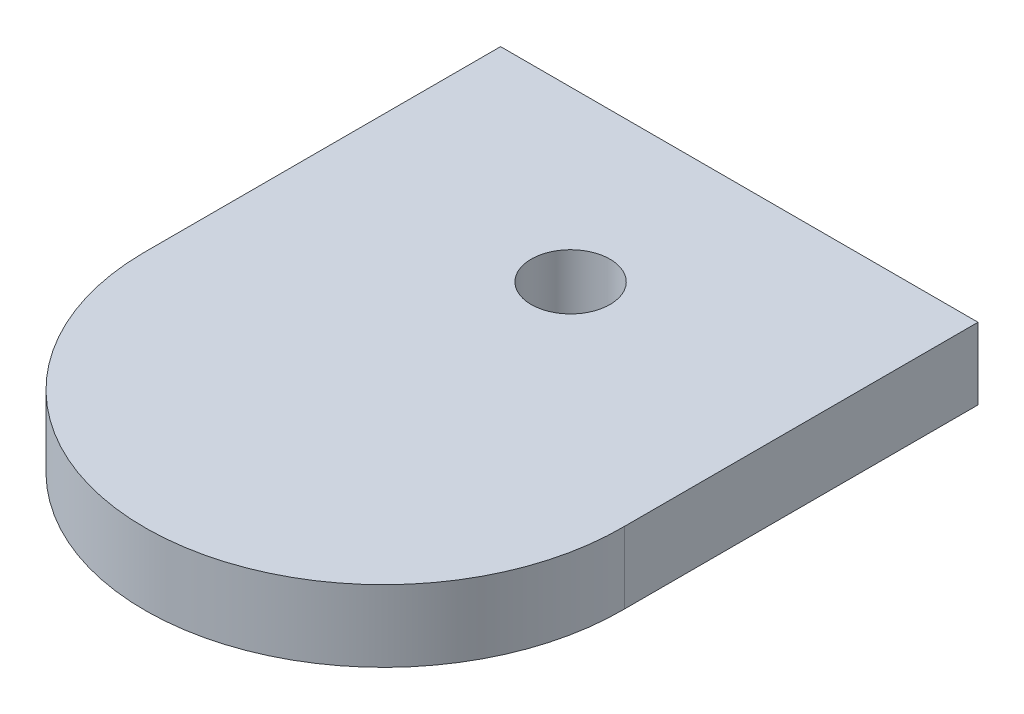
ISO-10303-21;
HEADER;
FILE_DESCRIPTION(('STEP AP214'),'2;1');
FILE_NAME('part.step','',(''),(''),'','','');
FILE_SCHEMA(('AUTOMOTIVE_DESIGN { 1 0 10303 214 1 1 1 1 }'));
ENDSEC;
DATA;
#1=APPLICATION_CONTEXT('core data for automotive mechanical design processes');
#2=APPLICATION_PROTOCOL_DEFINITION('international standard','automotive_design',2000,#1);
#3=PRODUCT_CONTEXT('',#1,'mechanical');
#4=PRODUCT('Part','Part','',(#3));
#5=PRODUCT_RELATED_PRODUCT_CATEGORY('part','',(#4));
#6=PRODUCT_DEFINITION_FORMATION('','',#4);
#7=PRODUCT_DEFINITION_CONTEXT('part definition',#1,'design');
#8=PRODUCT_DEFINITION('design','',#6,#7);
#9=PRODUCT_DEFINITION_SHAPE('','',#8);
#10=(LENGTH_UNIT() NAMED_UNIT(*) SI_UNIT(.MILLI.,.METRE.));
#11=(NAMED_UNIT(*) PLANE_ANGLE_UNIT() SI_UNIT($,.RADIAN.));
#12=(NAMED_UNIT(*) SI_UNIT($,.STERADIAN.) SOLID_ANGLE_UNIT());
#13=UNCERTAINTY_MEASURE_WITH_UNIT(LENGTH_MEASURE(1.E-05),#10,'distance_accuracy_value','');
#14=(GEOMETRIC_REPRESENTATION_CONTEXT(3) GLOBAL_UNCERTAINTY_ASSIGNED_CONTEXT((#13)) GLOBAL_UNIT_ASSIGNED_CONTEXT((#10,
#11,#12)) REPRESENTATION_CONTEXT('',''));
#15=CARTESIAN_POINT('',(0.,0.,0.));
#16=DIRECTION('',(0.,0.,1.));
#17=DIRECTION('',(1.,0.,0.));
#18=AXIS2_PLACEMENT_3D('',#15,#16,#17);
#19=CARTESIAN_POINT('',(0.,3.,0.));
#20=DIRECTION('',(0.,-1.,0.));
#21=DIRECTION('',(0.,0.,-1.));
#22=AXIS2_PLACEMENT_3D('',#19,#20,#21);
#23=PLANE('',#22);
#24=CARTESIAN_POINT('',(0.,3.,0.));
#25=DIRECTION('',(0.,1.,0.));
#26=DIRECTION('',(0.,0.,-1.));
#27=AXIS2_PLACEMENT_3D('',#24,#25,#26);
#28=CIRCLE('',#27,10.0004882006781);
#29=CARTESIAN_POINT('',(-10.,3.,0.0988142292490115));
#30=VERTEX_POINT('',#29);
#31=CARTESIAN_POINT('',(10.,3.,-0.0988142292490838));
#32=VERTEX_POINT('',#31);
#33=EDGE_CURVE('E87',#30,#32,#28,.T.);
#34=ORIENTED_EDGE('',*,*,#33,.T.);
#35=DIRECTION('',(0.,0.,-1.));
#36=VECTOR('',#35,1.);
#37=CARTESIAN_POINT('',(10.,3.,-0.0988142292490838));
#38=LINE('',#37,#36);
#39=CARTESIAN_POINT('',(10.,3.,-14.901185770751));
#40=VERTEX_POINT('',#39);
#41=EDGE_CURVE('E82',#32,#40,#38,.T.);
#42=ORIENTED_EDGE('',*,*,#41,.T.);
#43=DIRECTION('',(-1.,0.,0.));
#44=VECTOR('',#43,1.);
#45=CARTESIAN_POINT('',(10.,3.,-14.901185770751));
#46=LINE('',#45,#44);
#47=CARTESIAN_POINT('',(-10.,3.,-14.901185770751));
#48=VERTEX_POINT('',#47);
#49=EDGE_CURVE('E85',#40,#48,#46,.T.);
#50=ORIENTED_EDGE('',*,*,#49,.T.);
#51=DIRECTION('',(0.,0.,1.));
#52=VECTOR('',#51,1.);
#53=CARTESIAN_POINT('',(-10.,3.,-14.901185770751));
#54=LINE('',#53,#52);
#55=EDGE_CURVE('E52',#48,#30,#54,.T.);
#56=ORIENTED_EDGE('',*,*,#55,.T.);
#57=EDGE_LOOP('',(#34,#42,#50,#56));
#58=FACE_BOUND('',#57,.T.);
#59=CARTESIAN_POINT('',(0.,3.,-7.83391312582534));
#60=DIRECTION('',(0.,1.,0.));
#61=DIRECTION('',(0.,0.,1.));
#62=AXIS2_PLACEMENT_3D('',#59,#60,#61);
#63=CIRCLE('',#62,1.65);
#64=CARTESIAN_POINT('',(0.,3.,-6.18391312582534));
#65=VERTEX_POINT('',#64);
#66=EDGE_CURVE('E102',#65,#65,#63,.T.);
#67=ORIENTED_EDGE('',*,*,#66,.F.);
#68=EDGE_LOOP('',(#67));
#69=FACE_BOUND('',#68,.T.);
#70=ADVANCED_FACE('F35',(#58,#69),#23,.F.);
#71=CARTESIAN_POINT('',(0.,0.,0.));
#72=DIRECTION('',(0.,-1.,0.));
#73=DIRECTION('',(0.,0.,-1.));
#74=AXIS2_PLACEMENT_3D('',#71,#72,#73);
#75=PLANE('',#74);
#76=CARTESIAN_POINT('',(0.,0.,0.));
#77=DIRECTION('',(0.,1.,0.));
#78=DIRECTION('',(0.,0.,-1.));
#79=AXIS2_PLACEMENT_3D('',#76,#77,#78);
#80=CIRCLE('',#79,10.0004882006781);
#81=CARTESIAN_POINT('',(-10.,0.,0.0988142292490115));
#82=VERTEX_POINT('',#81);
#83=CARTESIAN_POINT('',(10.,0.,-0.0988142292490838));
#84=VERTEX_POINT('',#83);
#85=EDGE_CURVE('E99',#82,#84,#80,.T.);
#86=ORIENTED_EDGE('',*,*,#85,.F.);
#87=DIRECTION('',(0.,0.,1.));
#88=VECTOR('',#87,1.);
#89=CARTESIAN_POINT('',(-10.,0.,-14.901185770751));
#90=LINE('',#89,#88);
#91=CARTESIAN_POINT('',(-10.,0.,-14.901185770751));
#92=VERTEX_POINT('',#91);
#93=EDGE_CURVE('E75',#92,#82,#90,.T.);
#94=ORIENTED_EDGE('',*,*,#93,.F.);
#95=DIRECTION('',(-1.,0.,0.));
#96=VECTOR('',#95,1.);
#97=CARTESIAN_POINT('',(10.,0.,-14.901185770751));
#98=LINE('',#97,#96);
#99=CARTESIAN_POINT('',(10.,0.,-14.901185770751));
#100=VERTEX_POINT('',#99);
#101=EDGE_CURVE('E69',#100,#92,#98,.T.);
#102=ORIENTED_EDGE('',*,*,#101,.F.);
#103=DIRECTION('',(0.,0.,-1.));
#104=VECTOR('',#103,1.);
#105=CARTESIAN_POINT('',(10.,0.,-0.0988142292490838));
#106=LINE('',#105,#104);
#107=EDGE_CURVE('E91',#84,#100,#106,.T.);
#108=ORIENTED_EDGE('',*,*,#107,.F.);
#109=EDGE_LOOP('',(#86,#94,#102,#108));
#110=FACE_BOUND('',#109,.T.);
#111=CARTESIAN_POINT('',(0.,0.,-7.83391312582534));
#112=DIRECTION('',(0.,1.,0.));
#113=DIRECTION('',(0.,0.,1.));
#114=AXIS2_PLACEMENT_3D('',#111,#112,#113);
#115=CIRCLE('',#114,1.65);
#116=CARTESIAN_POINT('',(0.,0.,-6.18391312582534));
#117=VERTEX_POINT('',#116);
#118=EDGE_CURVE('E114',#117,#117,#115,.T.);
#119=ORIENTED_EDGE('',*,*,#118,.T.);
#120=EDGE_LOOP('',(#119));
#121=FACE_BOUND('',#120,.T.);
#122=ADVANCED_FACE('F110',(#110,#121),#75,.T.);
#123=CARTESIAN_POINT('',(0.,3.,0.));
#124=DIRECTION('',(0.,-1.,0.));
#125=DIRECTION('',(0.,0.,-1.));
#126=AXIS2_PLACEMENT_3D('',#123,#124,#125);
#127=CYLINDRICAL_SURFACE('',#126,10.0004882006781);
#128=ORIENTED_EDGE('',*,*,#85,.T.);
#129=DIRECTION('',(0.,-1.,0.));
#130=VECTOR('',#129,1.);
#131=CARTESIAN_POINT('',(10.,3.,-0.0988142292490838));
#132=LINE('',#131,#130);
#133=EDGE_CURVE('E11',#32,#84,#132,.T.);
#134=ORIENTED_EDGE('',*,*,#133,.F.);
#135=ORIENTED_EDGE('',*,*,#33,.F.);
#136=DIRECTION('',(0.,-1.,0.));
#137=VECTOR('',#136,1.);
#138=CARTESIAN_POINT('',(-10.,3.,0.0988142292490115));
#139=LINE('',#138,#137);
#140=EDGE_CURVE('E95',#30,#82,#139,.T.);
#141=ORIENTED_EDGE('',*,*,#140,.T.);
#142=EDGE_LOOP('',(#128,#134,#135,#141));
#143=FACE_BOUND('',#142,.T.);
#144=ADVANCED_FACE('F37',(#143),#127,.T.);
#145=CARTESIAN_POINT('',(10.,3.,-0.0988142292490838));
#146=DIRECTION('',(-1.,0.,0.));
#147=DIRECTION('',(0.,0.,1.));
#148=AXIS2_PLACEMENT_3D('',#145,#146,#147);
#149=PLANE('',#148);
#150=ORIENTED_EDGE('',*,*,#107,.T.);
#151=DIRECTION('',(0.,-1.,0.));
#152=VECTOR('',#151,1.);
#153=CARTESIAN_POINT('',(10.,3.,-14.901185770751));
#154=LINE('',#153,#152);
#155=EDGE_CURVE('E44',#40,#100,#154,.T.);
#156=ORIENTED_EDGE('',*,*,#155,.F.);
#157=ORIENTED_EDGE('',*,*,#41,.F.);
#158=ORIENTED_EDGE('',*,*,#133,.T.);
#159=EDGE_LOOP('',(#150,#156,#157,#158));
#160=FACE_BOUND('',#159,.T.);
#161=ADVANCED_FACE('F90',(#160),#149,.F.);
#162=CARTESIAN_POINT('',(10.,3.,-14.901185770751));
#163=DIRECTION('',(0.,0.,1.));
#164=DIRECTION('',(1.,0.,0.));
#165=AXIS2_PLACEMENT_3D('',#162,#163,#164);
#166=PLANE('',#165);
#167=ORIENTED_EDGE('',*,*,#101,.T.);
#168=DIRECTION('',(0.,-1.,0.));
#169=VECTOR('',#168,1.);
#170=CARTESIAN_POINT('',(-10.,3.,-14.901185770751));
#171=LINE('',#170,#169);
#172=EDGE_CURVE('E92',#48,#92,#171,.T.);
#173=ORIENTED_EDGE('',*,*,#172,.F.);
#174=ORIENTED_EDGE('',*,*,#49,.F.);
#175=ORIENTED_EDGE('',*,*,#155,.T.);
#176=EDGE_LOOP('',(#167,#173,#174,#175));
#177=FACE_BOUND('',#176,.T.);
#178=ADVANCED_FACE('F93',(#177),#166,.F.);
#179=CARTESIAN_POINT('',(-10.,3.,-14.901185770751));
#180=DIRECTION('',(1.,0.,0.));
#181=DIRECTION('',(0.,0.,-1.));
#182=AXIS2_PLACEMENT_3D('',#179,#180,#181);
#183=PLANE('',#182);
#184=ORIENTED_EDGE('',*,*,#93,.T.);
#185=ORIENTED_EDGE('',*,*,#140,.F.);
#186=ORIENTED_EDGE('',*,*,#55,.F.);
#187=ORIENTED_EDGE('',*,*,#172,.T.);
#188=EDGE_LOOP('',(#184,#185,#186,#187));
#189=FACE_BOUND('',#188,.T.);
#190=ADVANCED_FACE('F107',(#189),#183,.F.);
#191=CARTESIAN_POINT('',(0.,3.,-7.83391312582534));
#192=DIRECTION('',(0.,-1.,0.));
#193=DIRECTION('',(0.,0.,-1.));
#194=AXIS2_PLACEMENT_3D('',#191,#192,#193);
#195=CYLINDRICAL_SURFACE('',#194,1.65);
#196=ORIENTED_EDGE('',*,*,#66,.T.);
#197=EDGE_LOOP('',(#196));
#198=FACE_BOUND('',#197,.T.);
#199=ORIENTED_EDGE('',*,*,#118,.F.);
#200=EDGE_LOOP('',(#199));
#201=FACE_BOUND('',#200,.T.);
#202=ADVANCED_FACE('F120',(#198,#201),#195,.F.);
#203=CLOSED_SHELL('',(#70,#122,#144,#161,#178,#190,#202));
#204=MANIFOLD_SOLID_BREP('B2',#203);
#205=ADVANCED_BREP_SHAPE_REPRESENTATION('',(#18,#204),#14);
#206=SHAPE_DEFINITION_REPRESENTATION(#9,#205);
ENDSEC;
END-ISO-10303-21;
